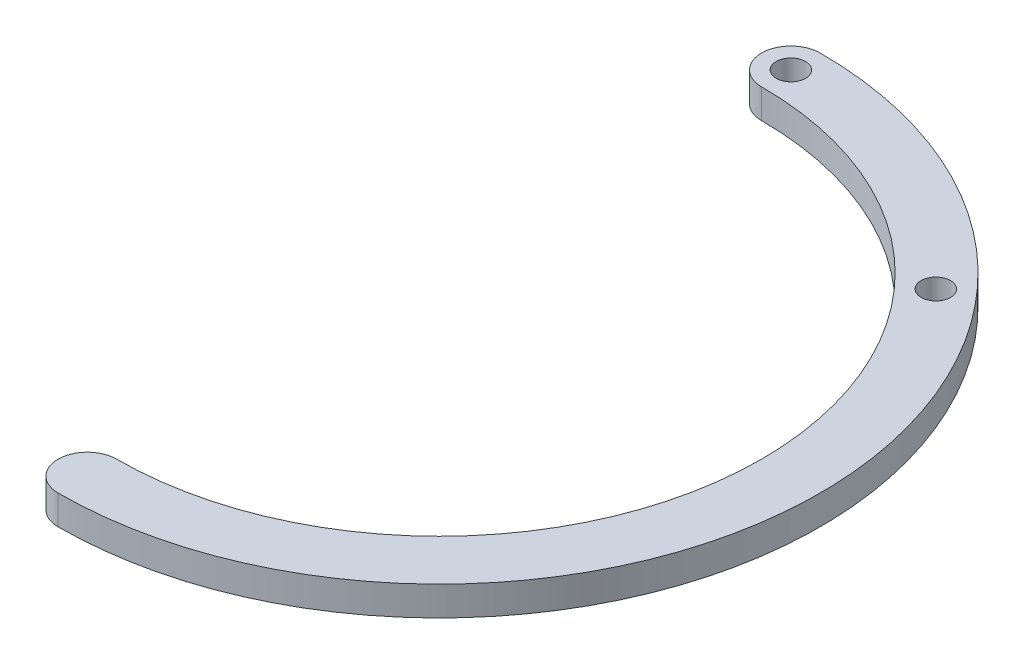
ISO-10303-21;
HEADER;
FILE_DESCRIPTION(('STEP AP214'),'2;1');
FILE_NAME('part.step','',(''),(''),'','','');
FILE_SCHEMA(('AUTOMOTIVE_DESIGN { 1 0 10303 214 1 1 1 1 }'));
ENDSEC;
DATA;
#1=APPLICATION_CONTEXT('core data for automotive mechanical design processes');
#2=APPLICATION_PROTOCOL_DEFINITION('international standard','automotive_design',2000,#1);
#3=PRODUCT_CONTEXT('',#1,'mechanical');
#4=PRODUCT('Part','Part','',(#3));
#5=PRODUCT_RELATED_PRODUCT_CATEGORY('part','',(#4));
#6=PRODUCT_DEFINITION_FORMATION('','',#4);
#7=PRODUCT_DEFINITION_CONTEXT('part definition',#1,'design');
#8=PRODUCT_DEFINITION('design','',#6,#7);
#9=PRODUCT_DEFINITION_SHAPE('','',#8);
#10=(LENGTH_UNIT() NAMED_UNIT(*) SI_UNIT(.MILLI.,.METRE.));
#11=(NAMED_UNIT(*) PLANE_ANGLE_UNIT() SI_UNIT($,.RADIAN.));
#12=(NAMED_UNIT(*) SI_UNIT($,.STERADIAN.) SOLID_ANGLE_UNIT());
#13=UNCERTAINTY_MEASURE_WITH_UNIT(LENGTH_MEASURE(1.E-05),#10,'distance_accuracy_value','');
#14=(GEOMETRIC_REPRESENTATION_CONTEXT(3) GLOBAL_UNCERTAINTY_ASSIGNED_CONTEXT((#13)) GLOBAL_UNIT_ASSIGNED_CONTEXT((#10,
#11,#12)) REPRESENTATION_CONTEXT('',''));
#15=CARTESIAN_POINT('',(0.,0.,0.));
#16=DIRECTION('',(0.,0.,1.));
#17=DIRECTION('',(1.,0.,0.));
#18=AXIS2_PLACEMENT_3D('',#15,#16,#17);
#19=CARTESIAN_POINT('',(0.,3.175,19.05));
#20=DIRECTION('',(0.,1.,0.));
#21=DIRECTION('',(0.,0.,1.));
#22=AXIS2_PLACEMENT_3D('',#19,#20,#21);
#23=PLANE('',#22);
#24=CARTESIAN_POINT('',(28.3980633142473,3.175,-25.4));
#25=DIRECTION('',(0.,1.,0.));
#26=DIRECTION('',(0.,0.,1.));
#27=AXIS2_PLACEMENT_3D('',#24,#25,#26);
#28=CIRCLE('',#27,1.5875);
#29=CARTESIAN_POINT('',(28.3980633142473,3.175,-23.8125));
#30=VERTEX_POINT('',#29);
#31=EDGE_CURVE('E100',#30,#30,#28,.T.);
#32=ORIENTED_EDGE('',*,*,#31,.F.);
#33=EDGE_LOOP('',(#32));
#34=FACE_BOUND('',#33,.T.);
#35=CARTESIAN_POINT('',(0.,3.175,38.1));
#36=DIRECTION('',(0.,1.,0.));
#37=DIRECTION('',(0.,0.,1.));
#38=AXIS2_PLACEMENT_3D('',#35,#36,#37);
#39=CIRCLE('',#38,3.175);
#40=CARTESIAN_POINT('',(0.,3.175,34.925));
#41=VERTEX_POINT('',#40);
#42=CARTESIAN_POINT('',(0.,3.175,41.275));
#43=VERTEX_POINT('',#42);
#44=EDGE_CURVE('E85',#41,#43,#39,.T.);
#45=ORIENTED_EDGE('',*,*,#44,.T.);
#46=CARTESIAN_POINT('',(0.,3.175,0.));
#47=DIRECTION('',(0.,1.,0.));
#48=DIRECTION('',(0.,0.,1.));
#49=AXIS2_PLACEMENT_3D('',#46,#47,#48);
#50=CIRCLE('',#49,41.275);
#51=CARTESIAN_POINT('',(0.,3.175,-41.275));
#52=VERTEX_POINT('',#51);
#53=EDGE_CURVE('E80',#43,#52,#50,.T.);
#54=ORIENTED_EDGE('',*,*,#53,.T.);
#55=CARTESIAN_POINT('',(0.,3.175,-38.1));
#56=DIRECTION('',(0.,1.,0.));
#57=DIRECTION('',(0.,0.,1.));
#58=AXIS2_PLACEMENT_3D('',#55,#56,#57);
#59=CIRCLE('',#58,3.175);
#60=CARTESIAN_POINT('',(0.,3.175,-34.925));
#61=VERTEX_POINT('',#60);
#62=EDGE_CURVE('E83',#52,#61,#59,.T.);
#63=ORIENTED_EDGE('',*,*,#62,.T.);
#64=CARTESIAN_POINT('',(0.,3.175,0.));
#65=DIRECTION('',(0.,-1.,0.));
#66=DIRECTION('',(0.,0.,1.));
#67=AXIS2_PLACEMENT_3D('',#64,#65,#66);
#68=CIRCLE('',#67,34.925);
#69=EDGE_CURVE('E50',#61,#41,#68,.T.);
#70=ORIENTED_EDGE('',*,*,#69,.T.);
#71=EDGE_LOOP('',(#45,#54,#63,#70));
#72=FACE_BOUND('',#71,.T.);
#73=CARTESIAN_POINT('',(0.,3.175,-38.1));
#74=DIRECTION('',(0.,1.,0.));
#75=DIRECTION('',(0.,0.,1.));
#76=AXIS2_PLACEMENT_3D('',#73,#74,#75);
#77=CIRCLE('',#76,1.5875);
#78=CARTESIAN_POINT('',(0.,3.175,-36.5125));
#79=VERTEX_POINT('',#78);
#80=EDGE_CURVE('E115',#79,#79,#77,.T.);
#81=ORIENTED_EDGE('',*,*,#80,.F.);
#82=EDGE_LOOP('',(#81));
#83=FACE_BOUND('',#82,.T.);
#84=ADVANCED_FACE('F33',(#34,#72,#83),#23,.T.);
#85=CARTESIAN_POINT('',(0.,0.,19.05));
#86=DIRECTION('',(0.,1.,0.));
#87=DIRECTION('',(0.,0.,1.));
#88=AXIS2_PLACEMENT_3D('',#85,#86,#87);
#89=PLANE('',#88);
#90=CARTESIAN_POINT('',(28.3980633142473,0.,-25.4));
#91=DIRECTION('',(0.,1.,0.));
#92=DIRECTION('',(0.,0.,1.));
#93=AXIS2_PLACEMENT_3D('',#90,#91,#92);
#94=CIRCLE('',#93,1.5875);
#95=CARTESIAN_POINT('',(28.3980633142473,0.,-23.8125));
#96=VERTEX_POINT('',#95);
#97=EDGE_CURVE('E112',#96,#96,#94,.T.);
#98=ORIENTED_EDGE('',*,*,#97,.T.);
#99=EDGE_LOOP('',(#98));
#100=FACE_BOUND('',#99,.T.);
#101=CARTESIAN_POINT('',(0.,0.,38.1));
#102=DIRECTION('',(0.,1.,0.));
#103=DIRECTION('',(0.,0.,1.));
#104=AXIS2_PLACEMENT_3D('',#101,#102,#103);
#105=CIRCLE('',#104,3.175);
#106=CARTESIAN_POINT('',(0.,0.,34.925));
#107=VERTEX_POINT('',#106);
#108=CARTESIAN_POINT('',(0.,0.,41.275));
#109=VERTEX_POINT('',#108);
#110=EDGE_CURVE('E97',#107,#109,#105,.T.);
#111=ORIENTED_EDGE('',*,*,#110,.F.);
#112=CARTESIAN_POINT('',(0.,0.,0.));
#113=DIRECTION('',(0.,-1.,0.));
#114=DIRECTION('',(0.,0.,1.));
#115=AXIS2_PLACEMENT_3D('',#112,#113,#114);
#116=CIRCLE('',#115,34.925);
#117=CARTESIAN_POINT('',(0.,0.,-34.925));
#118=VERTEX_POINT('',#117);
#119=EDGE_CURVE('E73',#118,#107,#116,.T.);
#120=ORIENTED_EDGE('',*,*,#119,.F.);
#121=CARTESIAN_POINT('',(0.,0.,-38.1));
#122=DIRECTION('',(0.,1.,0.));
#123=DIRECTION('',(0.,0.,1.));
#124=AXIS2_PLACEMENT_3D('',#121,#122,#123);
#125=CIRCLE('',#124,3.175);
#126=CARTESIAN_POINT('',(0.,0.,-41.275));
#127=VERTEX_POINT('',#126);
#128=EDGE_CURVE('E67',#127,#118,#125,.T.);
#129=ORIENTED_EDGE('',*,*,#128,.F.);
#130=CARTESIAN_POINT('',(0.,0.,0.));
#131=DIRECTION('',(0.,1.,0.));
#132=DIRECTION('',(0.,0.,1.));
#133=AXIS2_PLACEMENT_3D('',#130,#131,#132);
#134=CIRCLE('',#133,41.275);
#135=EDGE_CURVE('E89',#109,#127,#134,.T.);
#136=ORIENTED_EDGE('',*,*,#135,.F.);
#137=EDGE_LOOP('',(#111,#120,#129,#136));
#138=FACE_BOUND('',#137,.T.);
#139=CARTESIAN_POINT('',(0.,0.,-38.1));
#140=DIRECTION('',(0.,1.,0.));
#141=DIRECTION('',(0.,0.,1.));
#142=AXIS2_PLACEMENT_3D('',#139,#140,#141);
#143=CIRCLE('',#142,1.5875);
#144=CARTESIAN_POINT('',(0.,0.,-36.5125));
#145=VERTEX_POINT('',#144);
#146=EDGE_CURVE('E118',#145,#145,#143,.T.);
#147=ORIENTED_EDGE('',*,*,#146,.T.);
#148=EDGE_LOOP('',(#147));
#149=FACE_BOUND('',#148,.T.);
#150=ADVANCED_FACE('F108',(#100,#138,#149),#89,.F.);
#151=CARTESIAN_POINT('',(0.,3.175,38.1));
#152=DIRECTION('',(0.,-1.,0.));
#153=DIRECTION('',(0.,0.,-1.));
#154=AXIS2_PLACEMENT_3D('',#151,#152,#153);
#155=CYLINDRICAL_SURFACE('',#154,3.175);
#156=ORIENTED_EDGE('',*,*,#110,.T.);
#157=DIRECTION('',(0.,-1.,0.));
#158=VECTOR('',#157,1.);
#159=CARTESIAN_POINT('',(0.,3.175,41.275));
#160=LINE('',#159,#158);
#161=EDGE_CURVE('E11',#43,#109,#160,.T.);
#162=ORIENTED_EDGE('',*,*,#161,.F.);
#163=ORIENTED_EDGE('',*,*,#44,.F.);
#164=DIRECTION('',(0.,-1.,0.));
#165=VECTOR('',#164,1.);
#166=CARTESIAN_POINT('',(0.,3.175,34.925));
#167=LINE('',#166,#165);
#168=EDGE_CURVE('E93',#41,#107,#167,.T.);
#169=ORIENTED_EDGE('',*,*,#168,.T.);
#170=EDGE_LOOP('',(#156,#162,#163,#169));
#171=FACE_BOUND('',#170,.T.);
#172=ADVANCED_FACE('F35',(#171),#155,.T.);
#173=CARTESIAN_POINT('',(0.,3.175,0.));
#174=DIRECTION('',(0.,-1.,0.));
#175=DIRECTION('',(0.,0.,-1.));
#176=AXIS2_PLACEMENT_3D('',#173,#174,#175);
#177=CYLINDRICAL_SURFACE('',#176,41.275);
#178=ORIENTED_EDGE('',*,*,#135,.T.);
#179=DIRECTION('',(0.,-1.,0.));
#180=VECTOR('',#179,1.);
#181=CARTESIAN_POINT('',(0.,3.175,-41.275));
#182=LINE('',#181,#180);
#183=EDGE_CURVE('E42',#52,#127,#182,.T.);
#184=ORIENTED_EDGE('',*,*,#183,.F.);
#185=ORIENTED_EDGE('',*,*,#53,.F.);
#186=ORIENTED_EDGE('',*,*,#161,.T.);
#187=EDGE_LOOP('',(#178,#184,#185,#186));
#188=FACE_BOUND('',#187,.T.);
#189=ADVANCED_FACE('F88',(#188),#177,.T.);
#190=CARTESIAN_POINT('',(0.,3.175,-38.1));
#191=DIRECTION('',(0.,-1.,0.));
#192=DIRECTION('',(0.,0.,-1.));
#193=AXIS2_PLACEMENT_3D('',#190,#191,#192);
#194=CYLINDRICAL_SURFACE('',#193,3.175);
#195=ORIENTED_EDGE('',*,*,#128,.T.);
#196=DIRECTION('',(0.,-1.,0.));
#197=VECTOR('',#196,1.);
#198=CARTESIAN_POINT('',(0.,3.175,-34.925));
#199=LINE('',#198,#197);
#200=EDGE_CURVE('E90',#61,#118,#199,.T.);
#201=ORIENTED_EDGE('',*,*,#200,.F.);
#202=ORIENTED_EDGE('',*,*,#62,.F.);
#203=ORIENTED_EDGE('',*,*,#183,.T.);
#204=EDGE_LOOP('',(#195,#201,#202,#203));
#205=FACE_BOUND('',#204,.T.);
#206=ADVANCED_FACE('F91',(#205),#194,.T.);
#207=CARTESIAN_POINT('',(0.,3.175,0.));
#208=DIRECTION('',(0.,-1.,0.));
#209=DIRECTION('',(0.,0.,-1.));
#210=AXIS2_PLACEMENT_3D('',#207,#208,#209);
#211=CYLINDRICAL_SURFACE('',#210,34.925);
#212=ORIENTED_EDGE('',*,*,#119,.T.);
#213=ORIENTED_EDGE('',*,*,#168,.F.);
#214=ORIENTED_EDGE('',*,*,#69,.F.);
#215=ORIENTED_EDGE('',*,*,#200,.T.);
#216=EDGE_LOOP('',(#212,#213,#214,#215));
#217=FACE_BOUND('',#216,.T.);
#218=ADVANCED_FACE('F105',(#217),#211,.F.);
#219=CARTESIAN_POINT('',(28.3980633142473,3.175,-25.4));
#220=DIRECTION('',(0.,-1.,0.));
#221=DIRECTION('',(0.,0.,-1.));
#222=AXIS2_PLACEMENT_3D('',#219,#220,#221);
#223=CYLINDRICAL_SURFACE('',#222,1.5875);
#224=ORIENTED_EDGE('',*,*,#31,.T.);
#225=EDGE_LOOP('',(#224));
#226=FACE_BOUND('',#225,.T.);
#227=ORIENTED_EDGE('',*,*,#97,.F.);
#228=EDGE_LOOP('',(#227));
#229=FACE_BOUND('',#228,.T.);
#230=ADVANCED_FACE('F136',(#226,#229),#223,.F.);
#231=CARTESIAN_POINT('',(0.,3.175,-38.1));
#232=DIRECTION('',(0.,-1.,0.));
#233=DIRECTION('',(0.,0.,-1.));
#234=AXIS2_PLACEMENT_3D('',#231,#232,#233);
#235=CYLINDRICAL_SURFACE('',#234,1.5875);
#236=ORIENTED_EDGE('',*,*,#80,.T.);
#237=EDGE_LOOP('',(#236));
#238=FACE_BOUND('',#237,.T.);
#239=ORIENTED_EDGE('',*,*,#146,.F.);
#240=EDGE_LOOP('',(#239));
#241=FACE_BOUND('',#240,.T.);
#242=ADVANCED_FACE('F124',(#238,#241),#235,.F.);
#243=CLOSED_SHELL('',(#84,#150,#172,#189,#206,#218,#230,#242));
#244=MANIFOLD_SOLID_BREP('B2',#243);
#245=ADVANCED_BREP_SHAPE_REPRESENTATION('',(#18,#244),#14);
#246=SHAPE_DEFINITION_REPRESENTATION(#9,#245);
ENDSEC;
END-ISO-10303-21;
